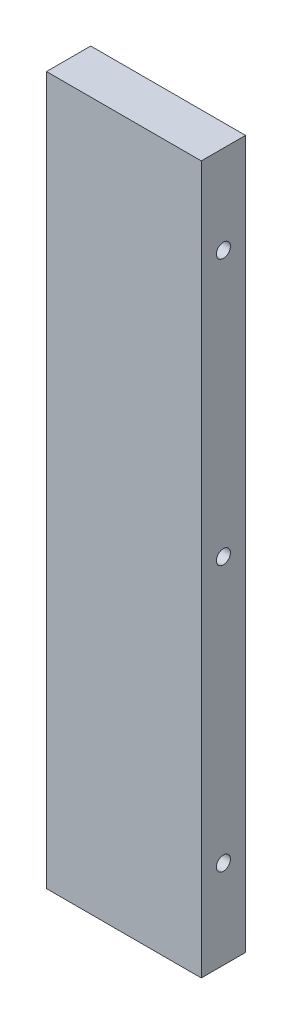
ISO-10303-21;
HEADER;
FILE_DESCRIPTION(('STEP AP214'),'2;1');
FILE_NAME('part.step','',(''),(''),'','','');
FILE_SCHEMA(('AUTOMOTIVE_DESIGN { 1 0 10303 214 1 1 1 1 }'));
ENDSEC;
DATA;
#1=APPLICATION_CONTEXT('core data for automotive mechanical design processes');
#2=APPLICATION_PROTOCOL_DEFINITION('international standard','automotive_design',2000,#1);
#3=PRODUCT_CONTEXT('',#1,'mechanical');
#4=PRODUCT('Part','Part','',(#3));
#5=PRODUCT_RELATED_PRODUCT_CATEGORY('part','',(#4));
#6=PRODUCT_DEFINITION_FORMATION('','',#4);
#7=PRODUCT_DEFINITION_CONTEXT('part definition',#1,'design');
#8=PRODUCT_DEFINITION('design','',#6,#7);
#9=PRODUCT_DEFINITION_SHAPE('','',#8);
#10=(LENGTH_UNIT() NAMED_UNIT(*) SI_UNIT(.MILLI.,.METRE.));
#11=(NAMED_UNIT(*) PLANE_ANGLE_UNIT() SI_UNIT($,.RADIAN.));
#12=(NAMED_UNIT(*) SI_UNIT($,.STERADIAN.) SOLID_ANGLE_UNIT());
#13=UNCERTAINTY_MEASURE_WITH_UNIT(LENGTH_MEASURE(1.E-05),#10,'distance_accuracy_value','');
#14=(GEOMETRIC_REPRESENTATION_CONTEXT(3) GLOBAL_UNCERTAINTY_ASSIGNED_CONTEXT((#13)) GLOBAL_UNIT_ASSIGNED_CONTEXT((#10,
#11,#12)) REPRESENTATION_CONTEXT('',''));
#15=CARTESIAN_POINT('',(0.,0.,0.));
#16=DIRECTION('',(0.,0.,1.));
#17=DIRECTION('',(1.,0.,0.));
#18=AXIS2_PLACEMENT_3D('',#15,#16,#17);
#19=CARTESIAN_POINT('',(-44.45,-78.2800336859192,12.7));
#20=DIRECTION('',(1.,0.,0.));
#21=DIRECTION('',(0.,0.,-1.));
#22=AXIS2_PLACEMENT_3D('',#19,#20,#21);
#23=PLANE('',#22);
#24=CARTESIAN_POINT('',(-44.45,99.5199663140808,6.35));
#25=DIRECTION('',(1.,0.,0.));
#26=DIRECTION('',(0.,0.,-1.));
#27=AXIS2_PLACEMENT_3D('',#24,#25,#26);
#28=CIRCLE('',#27,2.01929999999999);
#29=CARTESIAN_POINT('',(-44.45,99.5199663140808,4.33070000000001));
#30=VERTEX_POINT('',#29);
#31=EDGE_CURVE('E127',#30,#30,#28,.T.);
#32=ORIENTED_EDGE('',*,*,#31,.T.);
#33=EDGE_LOOP('',(#32));
#34=FACE_BOUND('',#33,.T.);
#35=CARTESIAN_POINT('',(-44.45,23.3199663140808,6.35));
#36=DIRECTION('',(1.,0.,0.));
#37=DIRECTION('',(0.,0.,-1.));
#38=AXIS2_PLACEMENT_3D('',#35,#36,#37);
#39=CIRCLE('',#38,2.01929999999999);
#40=CARTESIAN_POINT('',(-44.45,23.3199663140808,4.33070000000001));
#41=VERTEX_POINT('',#40);
#42=EDGE_CURVE('E121',#41,#41,#39,.T.);
#43=ORIENTED_EDGE('',*,*,#42,.T.);
#44=EDGE_LOOP('',(#43));
#45=FACE_BOUND('',#44,.T.);
#46=CARTESIAN_POINT('',(-44.45,-52.8800336859192,6.35));
#47=DIRECTION('',(1.,0.,0.));
#48=DIRECTION('',(0.,0.,-1.));
#49=AXIS2_PLACEMENT_3D('',#46,#47,#48);
#50=CIRCLE('',#49,2.01929999999999);
#51=CARTESIAN_POINT('',(-44.45,-52.8800336859192,4.3307));
#52=VERTEX_POINT('',#51);
#53=EDGE_CURVE('E105',#52,#52,#50,.T.);
#54=ORIENTED_EDGE('',*,*,#53,.T.);
#55=EDGE_LOOP('',(#54));
#56=FACE_BOUND('',#55,.T.);
#57=DIRECTION('',(0.,-1.,0.));
#58=VECTOR('',#57,1.);
#59=CARTESIAN_POINT('',(-44.45,-78.2800336859192,0.));
#60=LINE('',#59,#58);
#61=CARTESIAN_POINT('',(-44.45,124.919966314081,0.));
#62=VERTEX_POINT('',#61);
#63=CARTESIAN_POINT('',(-44.45,-78.2800336859192,0.));
#64=VERTEX_POINT('',#63);
#65=EDGE_CURVE('E102',#62,#64,#60,.T.);
#66=ORIENTED_EDGE('',*,*,#65,.T.);
#67=DIRECTION('',(0.,0.,-1.));
#68=VECTOR('',#67,1.);
#69=CARTESIAN_POINT('',(-44.45,-78.2800336859192,12.7));
#70=LINE('',#69,#68);
#71=CARTESIAN_POINT('',(-44.45,-78.2800336859192,12.7));
#72=VERTEX_POINT('',#71);
#73=EDGE_CURVE('E11',#72,#64,#70,.T.);
#74=ORIENTED_EDGE('',*,*,#73,.F.);
#75=DIRECTION('',(0.,-1.,0.));
#76=VECTOR('',#75,1.);
#77=CARTESIAN_POINT('',(-44.45,-78.2800336859192,12.7));
#78=LINE('',#77,#76);
#79=CARTESIAN_POINT('',(-44.45,124.919966314081,12.7));
#80=VERTEX_POINT('',#79);
#81=EDGE_CURVE('E90',#80,#72,#78,.T.);
#82=ORIENTED_EDGE('',*,*,#81,.F.);
#83=DIRECTION('',(0.,0.,-1.));
#84=VECTOR('',#83,1.);
#85=CARTESIAN_POINT('',(-44.45,124.919966314081,12.7));
#86=LINE('',#85,#84);
#87=EDGE_CURVE('E98',#80,#62,#86,.T.);
#88=ORIENTED_EDGE('',*,*,#87,.T.);
#89=EDGE_LOOP('',(#66,#74,#82,#88));
#90=FACE_BOUND('',#89,.T.);
#91=ADVANCED_FACE('F39',(#34,#45,#56,#90),#23,.F.);
#92=CARTESIAN_POINT('',(-44.45,-78.2800336859192,12.7));
#93=DIRECTION('',(0.,1.,0.));
#94=DIRECTION('',(0.,0.,1.));
#95=AXIS2_PLACEMENT_3D('',#92,#93,#94);
#96=PLANE('',#95);
#97=DIRECTION('',(1.,0.,0.));
#98=VECTOR('',#97,1.);
#99=CARTESIAN_POINT('',(-44.45,-78.2800336859192,0.));
#100=LINE('',#99,#98);
#101=CARTESIAN_POINT('',(0.,-78.2800336859192,0.));
#102=VERTEX_POINT('',#101);
#103=EDGE_CURVE('E94',#64,#102,#100,.T.);
#104=ORIENTED_EDGE('',*,*,#103,.T.);
#105=DIRECTION('',(0.,0.,-1.));
#106=VECTOR('',#105,1.);
#107=CARTESIAN_POINT('',(0.,-78.2800336859192,12.7));
#108=LINE('',#107,#106);
#109=CARTESIAN_POINT('',(0.,-78.2800336859192,12.7));
#110=VERTEX_POINT('',#109);
#111=EDGE_CURVE('E47',#110,#102,#108,.T.);
#112=ORIENTED_EDGE('',*,*,#111,.F.);
#113=DIRECTION('',(1.,0.,0.));
#114=VECTOR('',#113,1.);
#115=CARTESIAN_POINT('',(-44.45,-78.2800336859192,12.7));
#116=LINE('',#115,#114);
#117=EDGE_CURVE('E85',#72,#110,#116,.T.);
#118=ORIENTED_EDGE('',*,*,#117,.F.);
#119=ORIENTED_EDGE('',*,*,#73,.T.);
#120=EDGE_LOOP('',(#104,#112,#118,#119));
#121=FACE_BOUND('',#120,.T.);
#122=ADVANCED_FACE('F93',(#121),#96,.F.);
#123=CARTESIAN_POINT('',(0.,-78.2800336859192,12.7));
#124=DIRECTION('',(-1.,0.,0.));
#125=DIRECTION('',(0.,0.,1.));
#126=AXIS2_PLACEMENT_3D('',#123,#124,#125);
#127=PLANE('',#126);
#128=CARTESIAN_POINT('',(0.,99.5199663140808,6.35));
#129=DIRECTION('',(1.,0.,0.));
#130=DIRECTION('',(0.,0.,-1.));
#131=AXIS2_PLACEMENT_3D('',#128,#129,#130);
#132=CIRCLE('',#131,2.01929999999999);
#133=CARTESIAN_POINT('',(0.,99.5199663140808,4.33070000000001));
#134=VERTEX_POINT('',#133);
#135=EDGE_CURVE('E130',#134,#134,#132,.T.);
#136=ORIENTED_EDGE('',*,*,#135,.F.);
#137=EDGE_LOOP('',(#136));
#138=FACE_BOUND('',#137,.T.);
#139=CARTESIAN_POINT('',(0.,23.3199663140808,6.35));
#140=DIRECTION('',(1.,0.,0.));
#141=DIRECTION('',(0.,0.,-1.));
#142=AXIS2_PLACEMENT_3D('',#139,#140,#141);
#143=CIRCLE('',#142,2.01929999999999);
#144=CARTESIAN_POINT('',(0.,23.3199663140808,4.33070000000001));
#145=VERTEX_POINT('',#144);
#146=EDGE_CURVE('E124',#145,#145,#143,.T.);
#147=ORIENTED_EDGE('',*,*,#146,.F.);
#148=EDGE_LOOP('',(#147));
#149=FACE_BOUND('',#148,.T.);
#150=CARTESIAN_POINT('',(0.,-52.8800336859192,6.35));
#151=DIRECTION('',(1.,0.,0.));
#152=DIRECTION('',(0.,0.,-1.));
#153=AXIS2_PLACEMENT_3D('',#150,#151,#152);
#154=CIRCLE('',#153,2.01929999999999);
#155=CARTESIAN_POINT('',(0.,-52.8800336859192,4.33070000000001));
#156=VERTEX_POINT('',#155);
#157=EDGE_CURVE('E118',#156,#156,#154,.T.);
#158=ORIENTED_EDGE('',*,*,#157,.F.);
#159=EDGE_LOOP('',(#158));
#160=FACE_BOUND('',#159,.T.);
#161=DIRECTION('',(0.,1.,0.));
#162=VECTOR('',#161,1.);
#163=CARTESIAN_POINT('',(0.,-78.2800336859192,0.));
#164=LINE('',#163,#162);
#165=CARTESIAN_POINT('',(0.,124.919966314081,0.));
#166=VERTEX_POINT('',#165);
#167=EDGE_CURVE('E72',#102,#166,#164,.T.);
#168=ORIENTED_EDGE('',*,*,#167,.T.);
#169=DIRECTION('',(0.,0.,-1.));
#170=VECTOR('',#169,1.);
#171=CARTESIAN_POINT('',(0.,124.919966314081,12.7));
#172=LINE('',#171,#170);
#173=CARTESIAN_POINT('',(0.,124.919966314081,12.7));
#174=VERTEX_POINT('',#173);
#175=EDGE_CURVE('E95',#174,#166,#172,.T.);
#176=ORIENTED_EDGE('',*,*,#175,.F.);
#177=DIRECTION('',(0.,1.,0.));
#178=VECTOR('',#177,1.);
#179=CARTESIAN_POINT('',(0.,-78.2800336859192,12.7));
#180=LINE('',#179,#178);
#181=EDGE_CURVE('E88',#110,#174,#180,.T.);
#182=ORIENTED_EDGE('',*,*,#181,.F.);
#183=ORIENTED_EDGE('',*,*,#111,.T.);
#184=EDGE_LOOP('',(#168,#176,#182,#183));
#185=FACE_BOUND('',#184,.T.);
#186=ADVANCED_FACE('F96',(#138,#149,#160,#185),#127,.F.);
#187=CARTESIAN_POINT('',(-44.45,124.919966314081,12.7));
#188=DIRECTION('',(0.,-1.,0.));
#189=DIRECTION('',(0.,0.,-1.));
#190=AXIS2_PLACEMENT_3D('',#187,#188,#189);
#191=PLANE('',#190);
#192=DIRECTION('',(-1.,0.,0.));
#193=VECTOR('',#192,1.);
#194=CARTESIAN_POINT('',(-44.45,124.919966314081,0.));
#195=LINE('',#194,#193);
#196=EDGE_CURVE('E78',#166,#62,#195,.T.);
#197=ORIENTED_EDGE('',*,*,#196,.T.);
#198=ORIENTED_EDGE('',*,*,#87,.F.);
#199=DIRECTION('',(-1.,0.,0.));
#200=VECTOR('',#199,1.);
#201=CARTESIAN_POINT('',(-44.45,124.919966314081,12.7));
#202=LINE('',#201,#200);
#203=EDGE_CURVE('E55',#174,#80,#202,.T.);
#204=ORIENTED_EDGE('',*,*,#203,.F.);
#205=ORIENTED_EDGE('',*,*,#175,.T.);
#206=EDGE_LOOP('',(#197,#198,#204,#205));
#207=FACE_BOUND('',#206,.T.);
#208=ADVANCED_FACE('F110',(#207),#191,.F.);
#209=CARTESIAN_POINT('',(0.,0.,12.7));
#210=DIRECTION('',(0.,0.,-1.));
#211=DIRECTION('',(-1.,0.,0.));
#212=AXIS2_PLACEMENT_3D('',#209,#210,#211);
#213=PLANE('',#212);
#214=ORIENTED_EDGE('',*,*,#81,.T.);
#215=ORIENTED_EDGE('',*,*,#117,.T.);
#216=ORIENTED_EDGE('',*,*,#181,.T.);
#217=ORIENTED_EDGE('',*,*,#203,.T.);
#218=EDGE_LOOP('',(#214,#215,#216,#217));
#219=FACE_BOUND('',#218,.T.);
#220=ADVANCED_FACE('F86',(#219),#213,.F.);
#221=CARTESIAN_POINT('',(0.,0.,0.));
#222=DIRECTION('',(0.,0.,-1.));
#223=DIRECTION('',(-1.,0.,0.));
#224=AXIS2_PLACEMENT_3D('',#221,#222,#223);
#225=PLANE('',#224);
#226=ORIENTED_EDGE('',*,*,#65,.F.);
#227=ORIENTED_EDGE('',*,*,#196,.F.);
#228=ORIENTED_EDGE('',*,*,#167,.F.);
#229=ORIENTED_EDGE('',*,*,#103,.F.);
#230=EDGE_LOOP('',(#226,#227,#228,#229));
#231=FACE_BOUND('',#230,.T.);
#232=ADVANCED_FACE('F113',(#231),#225,.T.);
#233=CARTESIAN_POINT('',(0.,-52.8800336859192,6.35));
#234=DIRECTION('',(1.,0.,0.));
#235=DIRECTION('',(0.,0.,-1.));
#236=AXIS2_PLACEMENT_3D('',#233,#234,#235);
#237=CYLINDRICAL_SURFACE('',#236,2.01929999999999);
#238=ORIENTED_EDGE('',*,*,#53,.F.);
#239=EDGE_LOOP('',(#238));
#240=FACE_BOUND('',#239,.T.);
#241=ORIENTED_EDGE('',*,*,#157,.T.);
#242=EDGE_LOOP('',(#241));
#243=FACE_BOUND('',#242,.T.);
#244=ADVANCED_FACE('F143',(#240,#243),#237,.F.);
#245=CARTESIAN_POINT('',(0.,23.3199663140808,6.35));
#246=DIRECTION('',(1.,0.,0.));
#247=DIRECTION('',(0.,0.,-1.));
#248=AXIS2_PLACEMENT_3D('',#245,#246,#247);
#249=CYLINDRICAL_SURFACE('',#248,2.01929999999999);
#250=ORIENTED_EDGE('',*,*,#42,.F.);
#251=EDGE_LOOP('',(#250));
#252=FACE_BOUND('',#251,.T.);
#253=ORIENTED_EDGE('',*,*,#146,.T.);
#254=EDGE_LOOP('',(#253));
#255=FACE_BOUND('',#254,.T.);
#256=ADVANCED_FACE('F145',(#252,#255),#249,.F.);
#257=CARTESIAN_POINT('',(0.,99.5199663140808,6.35));
#258=DIRECTION('',(1.,0.,0.));
#259=DIRECTION('',(0.,0.,-1.));
#260=AXIS2_PLACEMENT_3D('',#257,#258,#259);
#261=CYLINDRICAL_SURFACE('',#260,2.01929999999999);
#262=ORIENTED_EDGE('',*,*,#31,.F.);
#263=EDGE_LOOP('',(#262));
#264=FACE_BOUND('',#263,.T.);
#265=ORIENTED_EDGE('',*,*,#135,.T.);
#266=EDGE_LOOP('',(#265));
#267=FACE_BOUND('',#266,.T.);
#268=ADVANCED_FACE('F134',(#264,#267),#261,.F.);
#269=CLOSED_SHELL('',(#91,#122,#186,#208,#220,#232,#244,#256,#268));
#270=MANIFOLD_SOLID_BREP('B2',#269);
#271=ADVANCED_BREP_SHAPE_REPRESENTATION('',(#18,#270),#14);
#272=SHAPE_DEFINITION_REPRESENTATION(#9,#271);
ENDSEC;
END-ISO-10303-21;
